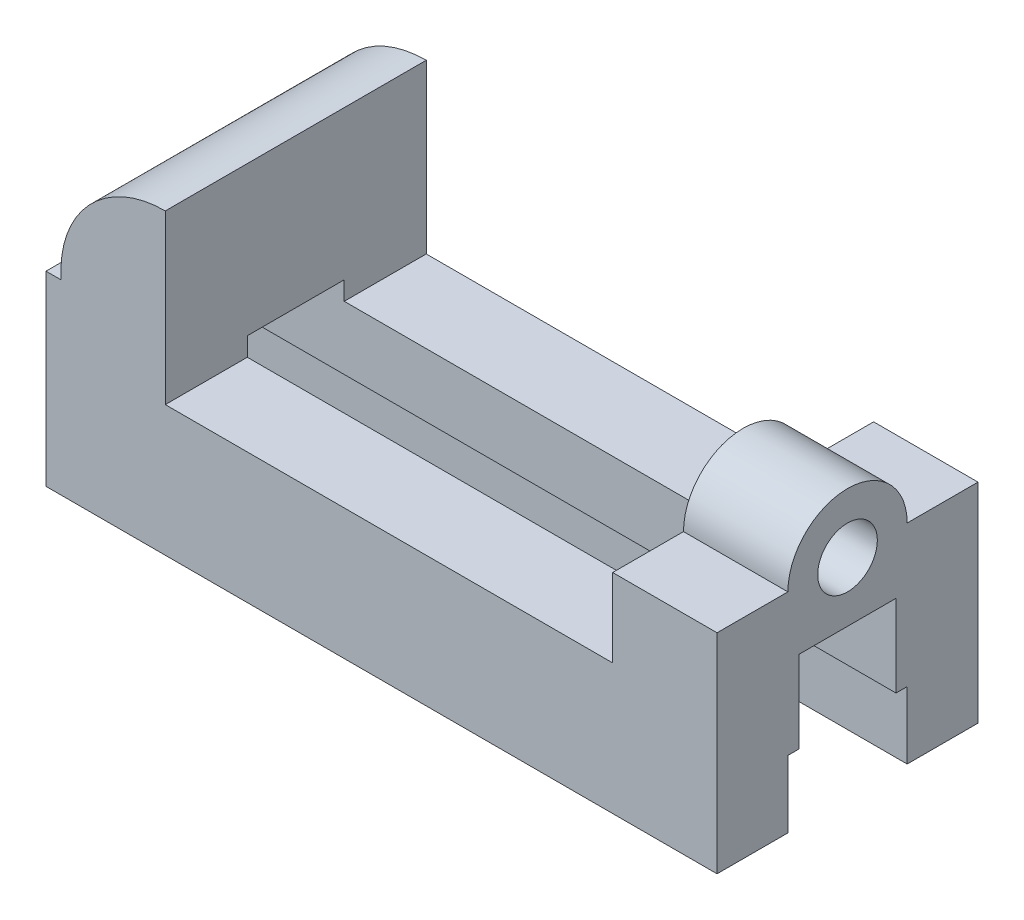
ISO-10303-21;
HEADER;
FILE_DESCRIPTION(('STEP AP214'),'2;1');
FILE_NAME('part.step','',(''),(''),'','','');
FILE_SCHEMA(('AUTOMOTIVE_DESIGN { 1 0 10303 214 1 1 1 1 }'));
ENDSEC;
DATA;
#1=APPLICATION_CONTEXT('core data for automotive mechanical design processes');
#2=APPLICATION_PROTOCOL_DEFINITION('international standard','automotive_design',2000,#1);
#3=PRODUCT_CONTEXT('',#1,'mechanical');
#4=PRODUCT('Part','Part','',(#3));
#5=PRODUCT_RELATED_PRODUCT_CATEGORY('part','',(#4));
#6=PRODUCT_DEFINITION_FORMATION('','',#4);
#7=PRODUCT_DEFINITION_CONTEXT('part definition',#1,'design');
#8=PRODUCT_DEFINITION('design','',#6,#7);
#9=PRODUCT_DEFINITION_SHAPE('','',#8);
#10=(LENGTH_UNIT() NAMED_UNIT(*) SI_UNIT(.MILLI.,.METRE.));
#11=(NAMED_UNIT(*) PLANE_ANGLE_UNIT() SI_UNIT($,.RADIAN.));
#12=(NAMED_UNIT(*) SI_UNIT($,.STERADIAN.) SOLID_ANGLE_UNIT());
#13=UNCERTAINTY_MEASURE_WITH_UNIT(LENGTH_MEASURE(1.E-05),#10,'distance_accuracy_value','');
#14=(GEOMETRIC_REPRESENTATION_CONTEXT(3) GLOBAL_UNCERTAINTY_ASSIGNED_CONTEXT((#13)) GLOBAL_UNIT_ASSIGNED_CONTEXT((#10,
#11,#12)) REPRESENTATION_CONTEXT('',''));
#15=CARTESIAN_POINT('',(0.,0.,0.));
#16=DIRECTION('',(0.,0.,1.));
#17=DIRECTION('',(1.,0.,0.));
#18=AXIS2_PLACEMENT_3D('',#15,#16,#17);
#19=CARTESIAN_POINT('',(180.,56.,35.));
#20=DIRECTION('',(0.,-1.,0.));
#21=DIRECTION('',(0.,0.,-1.));
#22=AXIS2_PLACEMENT_3D('',#19,#20,#21);
#23=PLANE('',#22);
#24=DIRECTION('',(0.,0.,-1.));
#25=VECTOR('',#24,1.);
#26=CARTESIAN_POINT('',(152.,56.,35.));
#27=LINE('',#26,#25);
#28=CARTESIAN_POINT('',(152.,56.,-16.));
#29=VERTEX_POINT('',#28);
#30=CARTESIAN_POINT('',(152.,56.,-35.));
#31=VERTEX_POINT('',#30);
#32=EDGE_CURVE('E219',#29,#31,#27,.T.);
#33=ORIENTED_EDGE('',*,*,#32,.F.);
#34=DIRECTION('',(1.,0.,0.));
#35=VECTOR('',#34,1.);
#36=CARTESIAN_POINT('',(106.745166004061,56.,-16.));
#37=LINE('',#36,#35);
#38=CARTESIAN_POINT('',(180.,56.,-16.));
#39=VERTEX_POINT('',#38);
#40=EDGE_CURVE('E202',#29,#39,#37,.T.);
#41=ORIENTED_EDGE('',*,*,#40,.T.);
#42=DIRECTION('',(0.,0.,-1.));
#43=VECTOR('',#42,1.);
#44=CARTESIAN_POINT('',(180.,56.,35.));
#45=LINE('',#44,#43);
#46=CARTESIAN_POINT('',(180.,56.,-35.));
#47=VERTEX_POINT('',#46);
#48=EDGE_CURVE('E52',#39,#47,#45,.T.);
#49=ORIENTED_EDGE('',*,*,#48,.T.);
#50=DIRECTION('',(-1.,0.,0.));
#51=VECTOR('',#50,1.);
#52=CARTESIAN_POINT('',(180.,56.,-35.));
#53=LINE('',#52,#51);
#54=EDGE_CURVE('E281',#47,#31,#53,.T.);
#55=ORIENTED_EDGE('',*,*,#54,.T.);
#56=EDGE_LOOP('',(#33,#41,#49,#55));
#57=FACE_BOUND('',#56,.T.);
#58=ADVANCED_FACE('F43',(#57),#23,.F.);
#59=CARTESIAN_POINT('',(152.,35.,35.));
#60=DIRECTION('',(0.,-1.,0.));
#61=DIRECTION('',(1.,0.,0.));
#62=AXIS2_PLACEMENT_3D('',#59,#60,#61);
#63=PLANE('',#62);
#64=DIRECTION('',(0.,0.,-1.));
#65=VECTOR('',#64,1.);
#66=CARTESIAN_POINT('',(32.,35.,35.));
#67=LINE('',#66,#65);
#68=CARTESIAN_POINT('',(32.,35.,-13.));
#69=VERTEX_POINT('',#68);
#70=CARTESIAN_POINT('',(32.,35.,-35.));
#71=VERTEX_POINT('',#70);
#72=EDGE_CURVE('E232',#69,#71,#67,.T.);
#73=ORIENTED_EDGE('',*,*,#72,.F.);
#74=DIRECTION('',(1.,0.,0.));
#75=VECTOR('',#74,1.);
#76=CARTESIAN_POINT('',(152.,35.,-13.));
#77=LINE('',#76,#75);
#78=CARTESIAN_POINT('',(152.,35.,-13.));
#79=VERTEX_POINT('',#78);
#80=EDGE_CURVE('E319',#69,#79,#77,.T.);
#81=ORIENTED_EDGE('',*,*,#80,.T.);
#82=DIRECTION('',(0.,0.,-1.));
#83=VECTOR('',#82,1.);
#84=CARTESIAN_POINT('',(152.,35.,35.));
#85=LINE('',#84,#83);
#86=CARTESIAN_POINT('',(152.,35.,-35.));
#87=VERTEX_POINT('',#86);
#88=EDGE_CURVE('E227',#79,#87,#85,.T.);
#89=ORIENTED_EDGE('',*,*,#88,.T.);
#90=DIRECTION('',(-1.,0.,0.));
#91=VECTOR('',#90,1.);
#92=CARTESIAN_POINT('',(152.,35.,-35.));
#93=LINE('',#92,#91);
#94=EDGE_CURVE('E273',#87,#71,#93,.T.);
#95=ORIENTED_EDGE('',*,*,#94,.T.);
#96=EDGE_LOOP('',(#73,#81,#89,#95));
#97=FACE_BOUND('',#96,.T.);
#98=ADVANCED_FACE('F449',(#97),#63,.F.);
#99=CARTESIAN_POINT('',(0.,0.,35.));
#100=DIRECTION('',(0.,1.,0.));
#101=DIRECTION('',(-1.,0.,0.));
#102=AXIS2_PLACEMENT_3D('',#99,#100,#101);
#103=PLANE('',#102);
#104=DIRECTION('',(0.,0.,-1.));
#105=VECTOR('',#104,1.);
#106=CARTESIAN_POINT('',(180.,0.,35.));
#107=LINE('',#106,#105);
#108=CARTESIAN_POINT('',(180.,0.,-16.));
#109=VERTEX_POINT('',#108);
#110=CARTESIAN_POINT('',(180.,0.,-35.));
#111=VERTEX_POINT('',#110);
#112=EDGE_CURVE('E254',#109,#111,#107,.T.);
#113=ORIENTED_EDGE('',*,*,#112,.F.);
#114=DIRECTION('',(-1.,0.,0.));
#115=VECTOR('',#114,1.);
#116=CARTESIAN_POINT('',(180.,0.,-16.));
#117=LINE('',#116,#115);
#118=CARTESIAN_POINT('',(0.,0.,-16.));
#119=VERTEX_POINT('',#118);
#120=EDGE_CURVE('E346',#109,#119,#117,.T.);
#121=ORIENTED_EDGE('',*,*,#120,.T.);
#122=DIRECTION('',(0.,0.,-1.));
#123=VECTOR('',#122,1.);
#124=CARTESIAN_POINT('',(0.,0.,35.));
#125=LINE('',#124,#123);
#126=CARTESIAN_POINT('',(0.,0.,-35.));
#127=VERTEX_POINT('',#126);
#128=EDGE_CURVE('E249',#119,#127,#125,.T.);
#129=ORIENTED_EDGE('',*,*,#128,.T.);
#130=DIRECTION('',(1.,0.,0.));
#131=VECTOR('',#130,1.);
#132=CARTESIAN_POINT('',(0.,0.,-35.));
#133=LINE('',#132,#131);
#134=EDGE_CURVE('E255',#127,#111,#133,.T.);
#135=ORIENTED_EDGE('',*,*,#134,.T.);
#136=EDGE_LOOP('',(#113,#121,#129,#135));
#137=FACE_BOUND('',#136,.T.);
#138=ADVANCED_FACE('F443',(#137),#103,.F.);
#139=CARTESIAN_POINT('',(180.,0.,35.));
#140=DIRECTION('',(-1.,0.,0.));
#141=DIRECTION('',(0.,0.,1.));
#142=AXIS2_PLACEMENT_3D('',#139,#140,#141);
#143=PLANE('',#142);
#144=DIRECTION('',(0.,0.,-1.));
#145=VECTOR('',#144,1.);
#146=CARTESIAN_POINT('',(180.,40.,-13.));
#147=LINE('',#146,#145);
#148=CARTESIAN_POINT('',(180.,40.,13.));
#149=VERTEX_POINT('',#148);
#150=CARTESIAN_POINT('',(180.,40.,-13.));
#151=VERTEX_POINT('',#150);
#152=EDGE_CURVE('E413',#149,#151,#147,.T.);
#153=ORIENTED_EDGE('',*,*,#152,.T.);
#154=DIRECTION('',(0.,-1.,0.));
#155=VECTOR('',#154,1.);
#156=CARTESIAN_POINT('',(180.,18.,-13.));
#157=LINE('',#156,#155);
#158=CARTESIAN_POINT('',(180.,18.,-13.));
#159=VERTEX_POINT('',#158);
#160=EDGE_CURVE('E409',#151,#159,#157,.T.);
#161=ORIENTED_EDGE('',*,*,#160,.T.);
#162=DIRECTION('',(0.,0.,-1.));
#163=VECTOR('',#162,1.);
#164=CARTESIAN_POINT('',(180.,18.,-16.));
#165=LINE('',#164,#163);
#166=CARTESIAN_POINT('',(180.,18.,-16.));
#167=VERTEX_POINT('',#166);
#168=EDGE_CURVE('E405',#159,#167,#165,.T.);
#169=ORIENTED_EDGE('',*,*,#168,.T.);
#170=DIRECTION('',(0.,-1.,0.));
#171=VECTOR('',#170,1.);
#172=CARTESIAN_POINT('',(180.,0.,-16.));
#173=LINE('',#172,#171);
#174=EDGE_CURVE('E351',#167,#109,#173,.T.);
#175=ORIENTED_EDGE('',*,*,#174,.T.);
#176=ORIENTED_EDGE('',*,*,#112,.T.);
#177=DIRECTION('',(0.,1.,0.));
#178=VECTOR('',#177,1.);
#179=CARTESIAN_POINT('',(180.,0.,-35.));
#180=LINE('',#179,#178);
#181=EDGE_CURVE('E285',#111,#47,#180,.T.);
#182=ORIENTED_EDGE('',*,*,#181,.T.);
#183=ORIENTED_EDGE('',*,*,#48,.F.);
#184=CARTESIAN_POINT('',(180.,56.,0.));
#185=DIRECTION('',(1.,0.,0.));
#186=DIRECTION('',(0.,0.,-1.));
#187=AXIS2_PLACEMENT_3D('',#184,#185,#186);
#188=CIRCLE('',#187,16.);
#189=CARTESIAN_POINT('',(180.,56.,16.));
#190=VERTEX_POINT('',#189);
#191=EDGE_CURVE('E432',#39,#190,#188,.T.);
#192=ORIENTED_EDGE('',*,*,#191,.T.);
#193=CARTESIAN_POINT('',(180.,56.,35.));
#194=VERTEX_POINT('',#193);
#195=EDGE_CURVE('E11',#194,#190,#45,.T.);
#196=ORIENTED_EDGE('',*,*,#195,.F.);
#197=DIRECTION('',(0.,1.,0.));
#198=VECTOR('',#197,1.);
#199=CARTESIAN_POINT('',(180.,0.,35.));
#200=LINE('',#199,#198);
#201=CARTESIAN_POINT('',(180.,0.,35.));
#202=VERTEX_POINT('',#201);
#203=EDGE_CURVE('E259',#202,#194,#200,.T.);
#204=ORIENTED_EDGE('',*,*,#203,.F.);
#205=CARTESIAN_POINT('',(180.,0.,16.));
#206=VERTEX_POINT('',#205);
#207=EDGE_CURVE('E250',#202,#206,#107,.T.);
#208=ORIENTED_EDGE('',*,*,#207,.T.);
#209=DIRECTION('',(0.,1.,0.));
#210=VECTOR('',#209,1.);
#211=CARTESIAN_POINT('',(180.,18.,16.));
#212=LINE('',#211,#210);
#213=CARTESIAN_POINT('',(180.,18.,16.));
#214=VERTEX_POINT('',#213);
#215=EDGE_CURVE('E378',#206,#214,#212,.T.);
#216=ORIENTED_EDGE('',*,*,#215,.T.);
#217=DIRECTION('',(0.,0.,-1.));
#218=VECTOR('',#217,1.);
#219=CARTESIAN_POINT('',(180.,18.,13.));
#220=LINE('',#219,#218);
#221=CARTESIAN_POINT('',(180.,18.,13.));
#222=VERTEX_POINT('',#221);
#223=EDGE_CURVE('E420',#214,#222,#220,.T.);
#224=ORIENTED_EDGE('',*,*,#223,.T.);
#225=DIRECTION('',(0.,1.,0.));
#226=VECTOR('',#225,1.);
#227=CARTESIAN_POINT('',(180.,40.,13.));
#228=LINE('',#227,#226);
#229=EDGE_CURVE('E416',#222,#149,#228,.T.);
#230=ORIENTED_EDGE('',*,*,#229,.T.);
#231=EDGE_LOOP('',(#153,#161,#169,#175,#176,#182,#183,#192,#196,#204,#208,#216,#224,#230));
#232=FACE_BOUND('',#231,.T.);
#233=CARTESIAN_POINT('',(180.,56.,0.));
#234=DIRECTION('',(1.,0.,0.));
#235=DIRECTION('',(0.,0.,-1.));
#236=AXIS2_PLACEMENT_3D('',#233,#234,#235);
#237=CIRCLE('',#236,8.);
#238=CARTESIAN_POINT('',(180.,56.,-8.));
#239=VERTEX_POINT('',#238);
#240=EDGE_CURVE('E435',#239,#239,#237,.T.);
#241=ORIENTED_EDGE('',*,*,#240,.F.);
#242=EDGE_LOOP('',(#241));
#243=FACE_BOUND('',#242,.T.);
#244=ADVANCED_FACE('F45',(#232,#243),#143,.F.);
#245=ORIENTED_EDGE('',*,*,#195,.T.);
#246=DIRECTION('',(1.,0.,0.));
#247=VECTOR('',#246,1.);
#248=CARTESIAN_POINT('',(106.745166004061,56.,16.));
#249=LINE('',#248,#247);
#250=CARTESIAN_POINT('',(152.,56.,16.));
#251=VERTEX_POINT('',#250);
#252=EDGE_CURVE('E199',#190,#251,#249,.F.);
#253=ORIENTED_EDGE('',*,*,#252,.T.);
#254=CARTESIAN_POINT('',(152.,56.,35.));
#255=VERTEX_POINT('',#254);
#256=EDGE_CURVE('E210',#255,#251,#27,.T.);
#257=ORIENTED_EDGE('',*,*,#256,.F.);
#258=DIRECTION('',(-1.,0.,0.));
#259=VECTOR('',#258,1.);
#260=CARTESIAN_POINT('',(180.,56.,35.));
#261=LINE('',#260,#259);
#262=EDGE_CURVE('E310',#194,#255,#261,.T.);
#263=ORIENTED_EDGE('',*,*,#262,.F.);
#264=EDGE_LOOP('',(#245,#253,#257,#263));
#265=FACE_BOUND('',#264,.T.);
#266=ADVANCED_FACE('F209',(#265),#23,.F.);
#267=CARTESIAN_POINT('',(152.,56.,35.));
#268=DIRECTION('',(1.,0.,0.));
#269=DIRECTION('',(0.,0.,-1.));
#270=AXIS2_PLACEMENT_3D('',#267,#268,#269);
#271=PLANE('',#270);
#272=CARTESIAN_POINT('',(152.,56.,0.));
#273=DIRECTION('',(1.,0.,0.));
#274=DIRECTION('',(0.,0.,-1.));
#275=AXIS2_PLACEMENT_3D('',#272,#273,#274);
#276=CIRCLE('',#275,8.);
#277=CARTESIAN_POINT('',(152.,56.,-8.));
#278=VERTEX_POINT('',#277);
#279=EDGE_CURVE('E205',#278,#278,#276,.F.);
#280=ORIENTED_EDGE('',*,*,#279,.F.);
#281=EDGE_LOOP('',(#280));
#282=FACE_BOUND('',#281,.T.);
#283=DIRECTION('',(0.,0.,1.));
#284=VECTOR('',#283,1.);
#285=CARTESIAN_POINT('',(152.,40.,35.));
#286=LINE('',#285,#284);
#287=CARTESIAN_POINT('',(152.,40.,-13.));
#288=VERTEX_POINT('',#287);
#289=CARTESIAN_POINT('',(152.,40.,13.));
#290=VERTEX_POINT('',#289);
#291=EDGE_CURVE('E327',#288,#290,#286,.T.);
#292=ORIENTED_EDGE('',*,*,#291,.T.);
#293=DIRECTION('',(0.,-1.,0.));
#294=VECTOR('',#293,1.);
#295=CARTESIAN_POINT('',(152.,56.,13.));
#296=LINE('',#295,#294);
#297=CARTESIAN_POINT('',(152.,35.,13.));
#298=VERTEX_POINT('',#297);
#299=EDGE_CURVE('E334',#290,#298,#296,.T.);
#300=ORIENTED_EDGE('',*,*,#299,.T.);
#301=CARTESIAN_POINT('',(152.,35.,35.));
#302=VERTEX_POINT('',#301);
#303=EDGE_CURVE('E222',#302,#298,#85,.T.);
#304=ORIENTED_EDGE('',*,*,#303,.F.);
#305=DIRECTION('',(0.,-1.,0.));
#306=VECTOR('',#305,1.);
#307=CARTESIAN_POINT('',(152.,56.,35.));
#308=LINE('',#307,#306);
#309=EDGE_CURVE('E217',#255,#302,#308,.T.);
#310=ORIENTED_EDGE('',*,*,#309,.F.);
#311=ORIENTED_EDGE('',*,*,#256,.T.);
#312=CARTESIAN_POINT('',(152.,56.,0.));
#313=DIRECTION('',(1.,0.,0.));
#314=DIRECTION('',(0.,0.,-1.));
#315=AXIS2_PLACEMENT_3D('',#312,#313,#314);
#316=CIRCLE('',#315,16.);
#317=EDGE_CURVE('E59',#251,#29,#316,.F.);
#318=ORIENTED_EDGE('',*,*,#317,.T.);
#319=ORIENTED_EDGE('',*,*,#32,.T.);
#320=DIRECTION('',(0.,-1.,0.));
#321=VECTOR('',#320,1.);
#322=CARTESIAN_POINT('',(152.,56.,-35.));
#323=LINE('',#322,#321);
#324=EDGE_CURVE('E277',#31,#87,#323,.T.);
#325=ORIENTED_EDGE('',*,*,#324,.T.);
#326=ORIENTED_EDGE('',*,*,#88,.F.);
#327=DIRECTION('',(0.,1.,0.));
#328=VECTOR('',#327,1.);
#329=CARTESIAN_POINT('',(152.,56.,-13.));
#330=LINE('',#329,#328);
#331=EDGE_CURVE('E289',#79,#288,#330,.T.);
#332=ORIENTED_EDGE('',*,*,#331,.T.);
#333=EDGE_LOOP('',(#292,#300,#304,#310,#311,#318,#319,#325,#326,#332));
#334=FACE_BOUND('',#333,.T.);
#335=ADVANCED_FACE('F215',(#282,#334),#271,.F.);
#336=ORIENTED_EDGE('',*,*,#303,.T.);
#337=DIRECTION('',(-1.,0.,0.));
#338=VECTOR('',#337,1.);
#339=CARTESIAN_POINT('',(152.,35.,13.));
#340=LINE('',#339,#338);
#341=CARTESIAN_POINT('',(32.,35.,13.));
#342=VERTEX_POINT('',#341);
#343=EDGE_CURVE('E338',#298,#342,#340,.T.);
#344=ORIENTED_EDGE('',*,*,#343,.T.);
#345=CARTESIAN_POINT('',(32.,35.,35.));
#346=VERTEX_POINT('',#345);
#347=EDGE_CURVE('E228',#346,#342,#67,.T.);
#348=ORIENTED_EDGE('',*,*,#347,.F.);
#349=DIRECTION('',(-1.,0.,0.));
#350=VECTOR('',#349,1.);
#351=CARTESIAN_POINT('',(152.,35.,35.));
#352=LINE('',#351,#350);
#353=EDGE_CURVE('E305',#302,#346,#352,.T.);
#354=ORIENTED_EDGE('',*,*,#353,.F.);
#355=EDGE_LOOP('',(#336,#344,#348,#354));
#356=FACE_BOUND('',#355,.T.);
#357=ADVANCED_FACE('F460',(#356),#63,.F.);
#358=CARTESIAN_POINT('',(32.,35.,35.));
#359=DIRECTION('',(-1.,0.,0.));
#360=DIRECTION('',(0.,0.,1.));
#361=AXIS2_PLACEMENT_3D('',#358,#359,#360);
#362=PLANE('',#361);
#363=DIRECTION('',(0.,0.,-1.));
#364=VECTOR('',#363,1.);
#365=CARTESIAN_POINT('',(32.,40.,35.));
#366=LINE('',#365,#364);
#367=CARTESIAN_POINT('',(32.,40.,13.));
#368=VERTEX_POINT('',#367);
#369=CARTESIAN_POINT('',(32.0000000000001,40.,-13.));
#370=VERTEX_POINT('',#369);
#371=EDGE_CURVE('E330',#368,#370,#366,.T.);
#372=ORIENTED_EDGE('',*,*,#371,.T.);
#373=DIRECTION('',(0.,-1.,0.));
#374=VECTOR('',#373,1.);
#375=CARTESIAN_POINT('',(32.,35.,-13.));
#376=LINE('',#375,#374);
#377=EDGE_CURVE('E323',#370,#69,#376,.T.);
#378=ORIENTED_EDGE('',*,*,#377,.T.);
#379=ORIENTED_EDGE('',*,*,#72,.T.);
#380=DIRECTION('',(0.,1.,0.));
#381=VECTOR('',#380,1.);
#382=CARTESIAN_POINT('',(32.,35.,-35.));
#383=LINE('',#382,#381);
#384=CARTESIAN_POINT('',(32.,80.,-35.));
#385=VERTEX_POINT('',#384);
#386=EDGE_CURVE('E270',#71,#385,#383,.T.);
#387=ORIENTED_EDGE('',*,*,#386,.T.);
#388=DIRECTION('',(0.,0.,-1.));
#389=VECTOR('',#388,1.);
#390=CARTESIAN_POINT('',(32.,80.,35.));
#391=LINE('',#390,#389);
#392=CARTESIAN_POINT('',(32.,80.,35.));
#393=VERTEX_POINT('',#392);
#394=EDGE_CURVE('E233',#393,#385,#391,.T.);
#395=ORIENTED_EDGE('',*,*,#394,.F.);
#396=DIRECTION('',(0.,1.,0.));
#397=VECTOR('',#396,1.);
#398=CARTESIAN_POINT('',(32.,35.,35.));
#399=LINE('',#398,#397);
#400=EDGE_CURVE('E302',#346,#393,#399,.T.);
#401=ORIENTED_EDGE('',*,*,#400,.F.);
#402=ORIENTED_EDGE('',*,*,#347,.T.);
#403=DIRECTION('',(0.,1.,0.));
#404=VECTOR('',#403,1.);
#405=CARTESIAN_POINT('',(32.,35.,13.));
#406=LINE('',#405,#404);
#407=EDGE_CURVE('E342',#342,#368,#406,.T.);
#408=ORIENTED_EDGE('',*,*,#407,.T.);
#409=EDGE_LOOP('',(#372,#378,#379,#387,#395,#401,#402,#408));
#410=FACE_BOUND('',#409,.T.);
#411=ADVANCED_FACE('F466',(#410),#362,.F.);
#412=CARTESIAN_POINT('',(32.,52.,35.));
#413=DIRECTION('',(0.,0.,-1.));
#414=DIRECTION('',(-1.,0.,0.));
#415=AXIS2_PLACEMENT_3D('',#412,#413,#414);
#416=CYLINDRICAL_SURFACE('',#415,28.);
#417=CARTESIAN_POINT('',(32.,52.,-35.));
#418=DIRECTION('',(0.,0.,1.));
#419=DIRECTION('',(1.,0.,0.));
#420=AXIS2_PLACEMENT_3D('',#417,#418,#419);
#421=CIRCLE('',#420,28.);
#422=CARTESIAN_POINT('',(4.07151991246212,50.,-35.));
#423=VERTEX_POINT('',#422);
#424=EDGE_CURVE('E267',#385,#423,#421,.T.);
#425=ORIENTED_EDGE('',*,*,#424,.T.);
#426=DIRECTION('',(0.,0.,-1.));
#427=VECTOR('',#426,1.);
#428=CARTESIAN_POINT('',(4.07151991246212,50.,35.));
#429=LINE('',#428,#427);
#430=CARTESIAN_POINT('',(4.07151991246212,50.,35.));
#431=VERTEX_POINT('',#430);
#432=EDGE_CURVE('E237',#431,#423,#429,.T.);
#433=ORIENTED_EDGE('',*,*,#432,.F.);
#434=CARTESIAN_POINT('',(32.,52.,35.));
#435=DIRECTION('',(0.,0.,1.));
#436=DIRECTION('',(1.,0.,0.));
#437=AXIS2_PLACEMENT_3D('',#434,#435,#436);
#438=CIRCLE('',#437,28.);
#439=EDGE_CURVE('E299',#393,#431,#438,.T.);
#440=ORIENTED_EDGE('',*,*,#439,.F.);
#441=ORIENTED_EDGE('',*,*,#394,.T.);
#442=EDGE_LOOP('',(#425,#433,#440,#441));
#443=FACE_BOUND('',#442,.T.);
#444=ADVANCED_FACE('F470',(#443),#416,.T.);
#445=CARTESIAN_POINT('',(4.07151991246212,50.,35.));
#446=DIRECTION('',(0.,-1.,0.));
#447=DIRECTION('',(1.,0.,0.));
#448=AXIS2_PLACEMENT_3D('',#445,#446,#447);
#449=PLANE('',#448);
#450=DIRECTION('',(-1.,0.,0.));
#451=VECTOR('',#450,1.);
#452=CARTESIAN_POINT('',(4.07151991246212,50.,-35.));
#453=LINE('',#452,#451);
#454=CARTESIAN_POINT('',(0.,50.,-35.));
#455=VERTEX_POINT('',#454);
#456=EDGE_CURVE('E264',#423,#455,#453,.T.);
#457=ORIENTED_EDGE('',*,*,#456,.T.);
#458=DIRECTION('',(0.,0.,-1.));
#459=VECTOR('',#458,1.);
#460=CARTESIAN_POINT('',(0.,50.,35.));
#461=LINE('',#460,#459);
#462=CARTESIAN_POINT('',(0.,50.,35.));
#463=VERTEX_POINT('',#462);
#464=EDGE_CURVE('E241',#463,#455,#461,.T.);
#465=ORIENTED_EDGE('',*,*,#464,.F.);
#466=DIRECTION('',(-1.,0.,0.));
#467=VECTOR('',#466,1.);
#468=CARTESIAN_POINT('',(4.07151991246212,50.,35.));
#469=LINE('',#468,#467);
#470=EDGE_CURVE('E296',#431,#463,#469,.T.);
#471=ORIENTED_EDGE('',*,*,#470,.F.);
#472=ORIENTED_EDGE('',*,*,#432,.T.);
#473=EDGE_LOOP('',(#457,#465,#471,#472));
#474=FACE_BOUND('',#473,.T.);
#475=ADVANCED_FACE('F474',(#474),#449,.F.);
#476=CARTESIAN_POINT('',(0.,50.,35.));
#477=DIRECTION('',(1.,0.,0.));
#478=DIRECTION('',(0.,1.,0.));
#479=AXIS2_PLACEMENT_3D('',#476,#477,#478);
#480=PLANE('',#479);
#481=ORIENTED_EDGE('',*,*,#128,.F.);
#482=DIRECTION('',(0.,-1.,0.));
#483=VECTOR('',#482,1.);
#484=CARTESIAN_POINT('',(0.,0.,-16.));
#485=LINE('',#484,#483);
#486=CARTESIAN_POINT('',(0.,18.,-16.));
#487=VERTEX_POINT('',#486);
#488=EDGE_CURVE('E375',#487,#119,#485,.T.);
#489=ORIENTED_EDGE('',*,*,#488,.F.);
#490=DIRECTION('',(0.,0.,-1.));
#491=VECTOR('',#490,1.);
#492=CARTESIAN_POINT('',(0.,18.,-16.));
#493=LINE('',#492,#491);
#494=CARTESIAN_POINT('',(0.,18.,-13.));
#495=VERTEX_POINT('',#494);
#496=EDGE_CURVE('E379',#495,#487,#493,.T.);
#497=ORIENTED_EDGE('',*,*,#496,.F.);
#498=DIRECTION('',(0.,-1.,0.));
#499=VECTOR('',#498,1.);
#500=CARTESIAN_POINT('',(0.,18.,-13.));
#501=LINE('',#500,#499);
#502=CARTESIAN_POINT('',(0.,40.,-13.));
#503=VERTEX_POINT('',#502);
#504=EDGE_CURVE('E383',#503,#495,#501,.T.);
#505=ORIENTED_EDGE('',*,*,#504,.F.);
#506=DIRECTION('',(0.,0.,-1.));
#507=VECTOR('',#506,1.);
#508=CARTESIAN_POINT('',(0.,40.,-13.));
#509=LINE('',#508,#507);
#510=CARTESIAN_POINT('',(0.,40.,13.));
#511=VERTEX_POINT('',#510);
#512=EDGE_CURVE('E387',#511,#503,#509,.T.);
#513=ORIENTED_EDGE('',*,*,#512,.F.);
#514=DIRECTION('',(0.,1.,0.));
#515=VECTOR('',#514,1.);
#516=CARTESIAN_POINT('',(0.,40.,13.));
#517=LINE('',#516,#515);
#518=CARTESIAN_POINT('',(0.,18.,13.));
#519=VERTEX_POINT('',#518);
#520=EDGE_CURVE('E391',#519,#511,#517,.T.);
#521=ORIENTED_EDGE('',*,*,#520,.F.);
#522=DIRECTION('',(0.,0.,-1.));
#523=VECTOR('',#522,1.);
#524=CARTESIAN_POINT('',(0.,18.,13.));
#525=LINE('',#524,#523);
#526=CARTESIAN_POINT('',(0.,18.,16.));
#527=VERTEX_POINT('',#526);
#528=EDGE_CURVE('E394',#527,#519,#525,.T.);
#529=ORIENTED_EDGE('',*,*,#528,.F.);
#530=DIRECTION('',(0.,1.,0.));
#531=VECTOR('',#530,1.);
#532=CARTESIAN_POINT('',(0.,18.,16.));
#533=LINE('',#532,#531);
#534=CARTESIAN_POINT('',(0.,0.,16.));
#535=VERTEX_POINT('',#534);
#536=EDGE_CURVE('E398',#535,#527,#533,.T.);
#537=ORIENTED_EDGE('',*,*,#536,.F.);
#538=CARTESIAN_POINT('',(0.,0.,35.));
#539=VERTEX_POINT('',#538);
#540=EDGE_CURVE('E245',#539,#535,#125,.T.);
#541=ORIENTED_EDGE('',*,*,#540,.F.);
#542=DIRECTION('',(0.,-1.,0.));
#543=VECTOR('',#542,1.);
#544=CARTESIAN_POINT('',(0.,50.,35.));
#545=LINE('',#544,#543);
#546=EDGE_CURVE('E293',#463,#539,#545,.T.);
#547=ORIENTED_EDGE('',*,*,#546,.F.);
#548=ORIENTED_EDGE('',*,*,#464,.T.);
#549=DIRECTION('',(0.,-1.,0.));
#550=VECTOR('',#549,1.);
#551=CARTESIAN_POINT('',(0.,50.,-35.));
#552=LINE('',#551,#550);
#553=EDGE_CURVE('E260',#455,#127,#552,.T.);
#554=ORIENTED_EDGE('',*,*,#553,.T.);
#555=EDGE_LOOP('',(#481,#489,#497,#505,#513,#521,#529,#537,#541,#547,#548,#554));
#556=FACE_BOUND('',#555,.T.);
#557=ADVANCED_FACE('F478',(#556),#480,.F.);
#558=ORIENTED_EDGE('',*,*,#540,.T.);
#559=DIRECTION('',(-1.,0.,0.));
#560=VECTOR('',#559,1.);
#561=CARTESIAN_POINT('',(180.,0.,16.));
#562=LINE('',#561,#560);
#563=EDGE_CURVE('E347',#206,#535,#562,.T.);
#564=ORIENTED_EDGE('',*,*,#563,.F.);
#565=ORIENTED_EDGE('',*,*,#207,.F.);
#566=DIRECTION('',(1.,0.,0.));
#567=VECTOR('',#566,1.);
#568=CARTESIAN_POINT('',(0.,0.,35.));
#569=LINE('',#568,#567);
#570=EDGE_CURVE('E290',#539,#202,#569,.T.);
#571=ORIENTED_EDGE('',*,*,#570,.F.);
#572=EDGE_LOOP('',(#558,#564,#565,#571));
#573=FACE_BOUND('',#572,.T.);
#574=ADVANCED_FACE('F452',(#573),#103,.F.);
#575=CARTESIAN_POINT('',(32.,52.,35.));
#576=DIRECTION('',(0.,0.,1.));
#577=DIRECTION('',(1.,0.,0.));
#578=AXIS2_PLACEMENT_3D('',#575,#576,#577);
#579=PLANE('',#578);
#580=ORIENTED_EDGE('',*,*,#203,.T.);
#581=ORIENTED_EDGE('',*,*,#262,.T.);
#582=ORIENTED_EDGE('',*,*,#309,.T.);
#583=ORIENTED_EDGE('',*,*,#353,.T.);
#584=ORIENTED_EDGE('',*,*,#400,.T.);
#585=ORIENTED_EDGE('',*,*,#439,.T.);
#586=ORIENTED_EDGE('',*,*,#470,.T.);
#587=ORIENTED_EDGE('',*,*,#546,.T.);
#588=ORIENTED_EDGE('',*,*,#570,.T.);
#589=EDGE_LOOP('',(#580,#581,#582,#583,#584,#585,#586,#587,#588));
#590=FACE_BOUND('',#589,.T.);
#591=ADVANCED_FACE('F484',(#590),#579,.T.);
#592=CARTESIAN_POINT('',(32.,52.,-35.));
#593=DIRECTION('',(0.,0.,1.));
#594=DIRECTION('',(1.,0.,0.));
#595=AXIS2_PLACEMENT_3D('',#592,#593,#594);
#596=PLANE('',#595);
#597=ORIENTED_EDGE('',*,*,#181,.F.);
#598=ORIENTED_EDGE('',*,*,#134,.F.);
#599=ORIENTED_EDGE('',*,*,#553,.F.);
#600=ORIENTED_EDGE('',*,*,#456,.F.);
#601=ORIENTED_EDGE('',*,*,#424,.F.);
#602=ORIENTED_EDGE('',*,*,#386,.F.);
#603=ORIENTED_EDGE('',*,*,#94,.F.);
#604=ORIENTED_EDGE('',*,*,#324,.F.);
#605=ORIENTED_EDGE('',*,*,#54,.F.);
#606=EDGE_LOOP('',(#597,#598,#599,#600,#601,#602,#603,#604,#605));
#607=FACE_BOUND('',#606,.T.);
#608=ADVANCED_FACE('F486',(#607),#596,.F.);
#609=CARTESIAN_POINT('',(180.,18.,-13.));
#610=DIRECTION('',(0.,0.,-1.));
#611=DIRECTION('',(-1.,0.,0.));
#612=AXIS2_PLACEMENT_3D('',#609,#610,#611);
#613=PLANE('',#612);
#614=ORIENTED_EDGE('',*,*,#80,.F.);
#615=ORIENTED_EDGE('',*,*,#377,.F.);
#616=DIRECTION('',(-1.,0.,0.));
#617=VECTOR('',#616,1.);
#618=CARTESIAN_POINT('',(180.,40.,-13.));
#619=LINE('',#618,#617);
#620=EDGE_CURVE('E361',#370,#503,#619,.T.);
#621=ORIENTED_EDGE('',*,*,#620,.T.);
#622=ORIENTED_EDGE('',*,*,#504,.T.);
#623=DIRECTION('',(-1.,0.,0.));
#624=VECTOR('',#623,1.);
#625=CARTESIAN_POINT('',(180.,18.,-13.));
#626=LINE('',#625,#624);
#627=EDGE_CURVE('E366',#159,#495,#626,.T.);
#628=ORIENTED_EDGE('',*,*,#627,.F.);
#629=ORIENTED_EDGE('',*,*,#160,.F.);
#630=EDGE_CURVE('E362',#151,#288,#619,.T.);
#631=ORIENTED_EDGE('',*,*,#630,.T.);
#632=ORIENTED_EDGE('',*,*,#331,.F.);
#633=EDGE_LOOP('',(#614,#615,#621,#622,#628,#629,#631,#632));
#634=FACE_BOUND('',#633,.T.);
#635=ADVANCED_FACE('F489',(#634),#613,.F.);
#636=CARTESIAN_POINT('',(180.,40.,-13.));
#637=DIRECTION('',(0.,1.,0.));
#638=DIRECTION('',(-1.,0.,0.));
#639=AXIS2_PLACEMENT_3D('',#636,#637,#638);
#640=PLANE('',#639);
#641=DIRECTION('',(-1.,0.,0.));
#642=VECTOR('',#641,1.);
#643=CARTESIAN_POINT('',(180.,40.,13.));
#644=LINE('',#643,#642);
#645=EDGE_CURVE('E357',#149,#290,#644,.T.);
#646=ORIENTED_EDGE('',*,*,#645,.T.);
#647=ORIENTED_EDGE('',*,*,#291,.F.);
#648=ORIENTED_EDGE('',*,*,#630,.F.);
#649=ORIENTED_EDGE('',*,*,#152,.F.);
#650=EDGE_LOOP('',(#646,#647,#648,#649));
#651=FACE_BOUND('',#650,.T.);
#652=ADVANCED_FACE('F508',(#651),#640,.F.);
#653=EDGE_CURVE('E67',#368,#511,#644,.T.);
#654=ORIENTED_EDGE('',*,*,#653,.T.);
#655=ORIENTED_EDGE('',*,*,#512,.T.);
#656=ORIENTED_EDGE('',*,*,#620,.F.);
#657=ORIENTED_EDGE('',*,*,#371,.F.);
#658=EDGE_LOOP('',(#654,#655,#656,#657));
#659=FACE_BOUND('',#658,.T.);
#660=ADVANCED_FACE('F507',(#659),#640,.F.);
#661=CARTESIAN_POINT('',(180.,40.,13.));
#662=DIRECTION('',(0.,0.,1.));
#663=DIRECTION('',(0.,-1.,0.));
#664=AXIS2_PLACEMENT_3D('',#661,#662,#663);
#665=PLANE('',#664);
#666=ORIENTED_EDGE('',*,*,#645,.F.);
#667=ORIENTED_EDGE('',*,*,#229,.F.);
#668=DIRECTION('',(-1.,0.,0.));
#669=VECTOR('',#668,1.);
#670=CARTESIAN_POINT('',(180.,18.,13.));
#671=LINE('',#670,#669);
#672=EDGE_CURVE('E354',#222,#519,#671,.T.);
#673=ORIENTED_EDGE('',*,*,#672,.T.);
#674=ORIENTED_EDGE('',*,*,#520,.T.);
#675=ORIENTED_EDGE('',*,*,#653,.F.);
#676=ORIENTED_EDGE('',*,*,#407,.F.);
#677=ORIENTED_EDGE('',*,*,#343,.F.);
#678=ORIENTED_EDGE('',*,*,#299,.F.);
#679=EDGE_LOOP('',(#666,#667,#673,#674,#675,#676,#677,#678));
#680=FACE_BOUND('',#679,.T.);
#681=ADVANCED_FACE('F503',(#680),#665,.F.);
#682=CARTESIAN_POINT('',(180.,0.,-16.));
#683=DIRECTION('',(0.,0.,-1.));
#684=DIRECTION('',(-1.,0.,0.));
#685=AXIS2_PLACEMENT_3D('',#682,#683,#684);
#686=PLANE('',#685);
#687=ORIENTED_EDGE('',*,*,#488,.T.);
#688=ORIENTED_EDGE('',*,*,#120,.F.);
#689=ORIENTED_EDGE('',*,*,#174,.F.);
#690=DIRECTION('',(-1.,0.,0.));
#691=VECTOR('',#690,1.);
#692=CARTESIAN_POINT('',(180.,18.,-16.));
#693=LINE('',#692,#691);
#694=EDGE_CURVE('E369',#167,#487,#693,.T.);
#695=ORIENTED_EDGE('',*,*,#694,.T.);
#696=EDGE_LOOP('',(#687,#688,#689,#695));
#697=FACE_BOUND('',#696,.T.);
#698=ADVANCED_FACE('F506',(#697),#686,.F.);
#699=CARTESIAN_POINT('',(180.,18.,-16.));
#700=DIRECTION('',(0.,1.,0.));
#701=DIRECTION('',(-1.,0.,0.));
#702=AXIS2_PLACEMENT_3D('',#699,#700,#701);
#703=PLANE('',#702);
#704=ORIENTED_EDGE('',*,*,#496,.T.);
#705=ORIENTED_EDGE('',*,*,#694,.F.);
#706=ORIENTED_EDGE('',*,*,#168,.F.);
#707=ORIENTED_EDGE('',*,*,#627,.T.);
#708=EDGE_LOOP('',(#704,#705,#706,#707));
#709=FACE_BOUND('',#708,.T.);
#710=ADVANCED_FACE('F501',(#709),#703,.F.);
#711=CARTESIAN_POINT('',(180.,18.,13.));
#712=DIRECTION('',(0.,1.,0.));
#713=DIRECTION('',(-1.,0.,0.));
#714=AXIS2_PLACEMENT_3D('',#711,#712,#713);
#715=PLANE('',#714);
#716=ORIENTED_EDGE('',*,*,#528,.T.);
#717=ORIENTED_EDGE('',*,*,#672,.F.);
#718=ORIENTED_EDGE('',*,*,#223,.F.);
#719=DIRECTION('',(-1.,0.,0.));
#720=VECTOR('',#719,1.);
#721=CARTESIAN_POINT('',(180.,18.,16.));
#722=LINE('',#721,#720);
#723=EDGE_CURVE('E350',#214,#527,#722,.T.);
#724=ORIENTED_EDGE('',*,*,#723,.T.);
#725=EDGE_LOOP('',(#716,#717,#718,#724));
#726=FACE_BOUND('',#725,.T.);
#727=ADVANCED_FACE('F497',(#726),#715,.F.);
#728=CARTESIAN_POINT('',(180.,18.,16.));
#729=DIRECTION('',(0.,0.,1.));
#730=DIRECTION('',(0.,-1.,0.));
#731=AXIS2_PLACEMENT_3D('',#728,#729,#730);
#732=PLANE('',#731);
#733=ORIENTED_EDGE('',*,*,#536,.T.);
#734=ORIENTED_EDGE('',*,*,#723,.F.);
#735=ORIENTED_EDGE('',*,*,#215,.F.);
#736=ORIENTED_EDGE('',*,*,#563,.T.);
#737=EDGE_LOOP('',(#733,#734,#735,#736));
#738=FACE_BOUND('',#737,.T.);
#739=ADVANCED_FACE('F494',(#738),#732,.F.);
#740=CARTESIAN_POINT('',(106.745166004061,56.,0.));
#741=DIRECTION('',(1.,0.,0.));
#742=DIRECTION('',(0.,0.,-1.));
#743=AXIS2_PLACEMENT_3D('',#740,#741,#742);
#744=CYLINDRICAL_SURFACE('',#743,8.);
#745=ORIENTED_EDGE('',*,*,#279,.T.);
#746=EDGE_LOOP('',(#745));
#747=FACE_BOUND('',#746,.T.);
#748=ORIENTED_EDGE('',*,*,#240,.T.);
#749=EDGE_LOOP('',(#748));
#750=FACE_BOUND('',#749,.T.);
#751=ADVANCED_FACE('F440',(#747,#750),#744,.F.);
#752=CARTESIAN_POINT('',(106.745166004061,56.,0.));
#753=DIRECTION('',(1.,0.,0.));
#754=DIRECTION('',(0.,0.,-1.));
#755=AXIS2_PLACEMENT_3D('',#752,#753,#754);
#756=CYLINDRICAL_SURFACE('',#755,16.);
#757=ORIENTED_EDGE('',*,*,#40,.F.);
#758=ORIENTED_EDGE('',*,*,#317,.F.);
#759=ORIENTED_EDGE('',*,*,#252,.F.);
#760=ORIENTED_EDGE('',*,*,#191,.F.);
#761=EDGE_LOOP('',(#757,#758,#759,#760));
#762=FACE_BOUND('',#761,.T.);
#763=ADVANCED_FACE('F198',(#762),#756,.T.);
#764=CLOSED_SHELL('',(#58,#98,#138,#244,#266,#335,#357,#411,#444,#475,#557,#574,#591,#608,#635,
#652,#660,#681,#698,#710,#727,#739,#751,#763));
#765=MANIFOLD_SOLID_BREP('B2',#764);
#766=ADVANCED_BREP_SHAPE_REPRESENTATION('',(#18,#765),#14);
#767=SHAPE_DEFINITION_REPRESENTATION(#9,#766);
ENDSEC;
END-ISO-10303-21;
